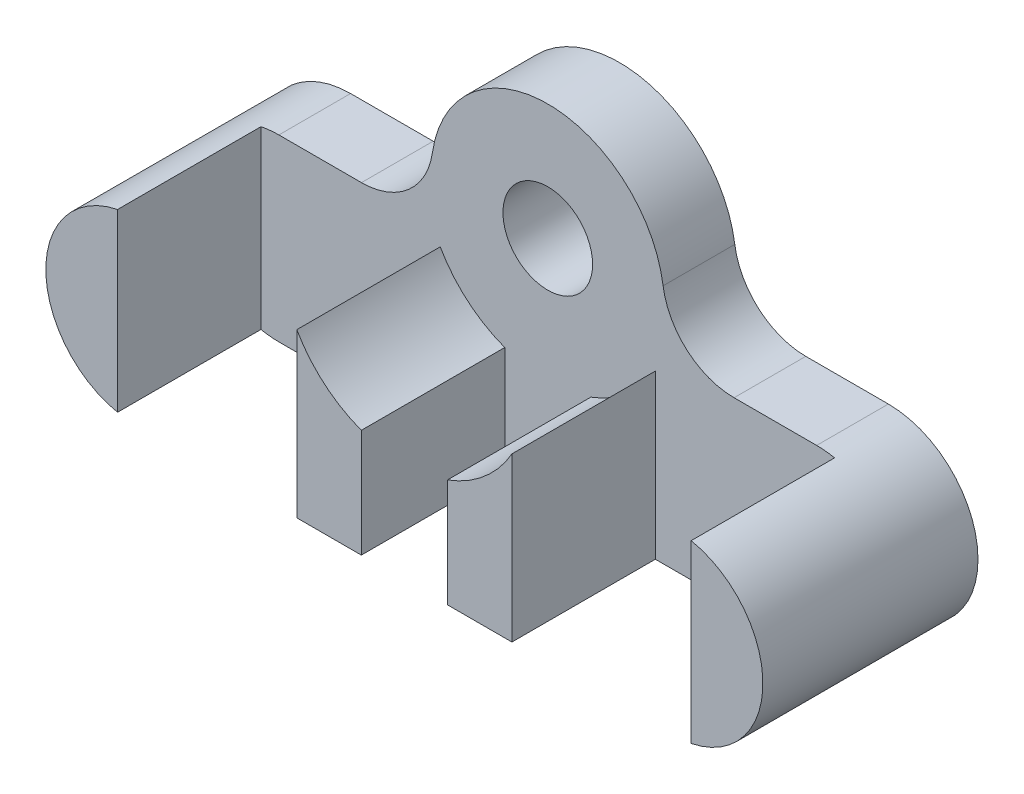
ISO-10303-21;
HEADER;
FILE_DESCRIPTION(('STEP AP214'),'2;1');
FILE_NAME('part.step','',(''),(''),'','','');
FILE_SCHEMA(('AUTOMOTIVE_DESIGN { 1 0 10303 214 1 1 1 1 }'));
ENDSEC;
DATA;
#1=APPLICATION_CONTEXT('core data for automotive mechanical design processes');
#2=APPLICATION_PROTOCOL_DEFINITION('international standard','automotive_design',2000,#1);
#3=PRODUCT_CONTEXT('',#1,'mechanical');
#4=PRODUCT('Part','Part','',(#3));
#5=PRODUCT_RELATED_PRODUCT_CATEGORY('part','',(#4));
#6=PRODUCT_DEFINITION_FORMATION('','',#4);
#7=PRODUCT_DEFINITION_CONTEXT('part definition',#1,'design');
#8=PRODUCT_DEFINITION('design','',#6,#7);
#9=PRODUCT_DEFINITION_SHAPE('','',#8);
#10=(LENGTH_UNIT() NAMED_UNIT(*) SI_UNIT(.MILLI.,.METRE.));
#11=(NAMED_UNIT(*) PLANE_ANGLE_UNIT() SI_UNIT($,.RADIAN.));
#12=(NAMED_UNIT(*) SI_UNIT($,.STERADIAN.) SOLID_ANGLE_UNIT());
#13=UNCERTAINTY_MEASURE_WITH_UNIT(LENGTH_MEASURE(1.E-05),#10,'distance_accuracy_value','');
#14=(GEOMETRIC_REPRESENTATION_CONTEXT(3) GLOBAL_UNCERTAINTY_ASSIGNED_CONTEXT((#13)) GLOBAL_UNIT_ASSIGNED_CONTEXT((#10,
#11,#12)) REPRESENTATION_CONTEXT('',''));
#15=CARTESIAN_POINT('',(0.,0.,0.));
#16=DIRECTION('',(0.,0.,1.));
#17=DIRECTION('',(1.,0.,0.));
#18=AXIS2_PLACEMENT_3D('',#15,#16,#17);
#19=CARTESIAN_POINT('',(0.,0.,6.));
#20=DIRECTION('',(0.,0.,-1.));
#21=DIRECTION('',(-1.,0.,0.));
#22=AXIS2_PLACEMENT_3D('',#19,#20,#21);
#23=CYLINDRICAL_SURFACE('',#22,3.45);
#24=DIRECTION('',(0.,0.,1.));
#25=VECTOR('',#24,1.);
#26=CARTESIAN_POINT('',(-1.2,-3.23457879792717,-1.8539285185263));
#27=LINE('',#26,#25);
#28=CARTESIAN_POINT('',(-1.2,-3.23457879792717,2.));
#29=VERTEX_POINT('',#28);
#30=CARTESIAN_POINT('',(-1.2,-3.23457879792717,6.));
#31=VERTEX_POINT('',#30);
#32=EDGE_CURVE('E187',#29,#31,#27,.T.);
#33=ORIENTED_EDGE('',*,*,#32,.F.);
#34=CARTESIAN_POINT('',(0.,0.,2.));
#35=DIRECTION('',(0.,0.,1.));
#36=DIRECTION('',(1.,0.,0.));
#37=AXIS2_PLACEMENT_3D('',#34,#35,#36);
#38=CIRCLE('',#37,3.45);
#39=CARTESIAN_POINT('',(-3.,-1.70367250374008,2.));
#40=VERTEX_POINT('',#39);
#41=EDGE_CURVE('E220',#40,#29,#38,.T.);
#42=ORIENTED_EDGE('',*,*,#41,.F.);
#43=DIRECTION('',(0.,0.,-1.));
#44=VECTOR('',#43,1.);
#45=CARTESIAN_POINT('',(-3.,-1.70367250374008,6.));
#46=LINE('',#45,#44);
#47=CARTESIAN_POINT('',(-3.,-1.70367250374008,6.));
#48=VERTEX_POINT('',#47);
#49=EDGE_CURVE('E244',#48,#40,#46,.T.);
#50=ORIENTED_EDGE('',*,*,#49,.F.);
#51=CARTESIAN_POINT('',(0.,0.,6.));
#52=DIRECTION('',(0.,0.,1.));
#53=DIRECTION('',(1.,0.,0.));
#54=AXIS2_PLACEMENT_3D('',#51,#52,#53);
#55=CIRCLE('',#54,3.45);
#56=EDGE_CURVE('E427',#48,#31,#55,.T.);
#57=ORIENTED_EDGE('',*,*,#56,.T.);
#58=EDGE_LOOP('',(#33,#42,#50,#57));
#59=FACE_BOUND('',#58,.T.);
#60=ADVANCED_FACE('F44',(#59),#23,.F.);
#61=CARTESIAN_POINT('',(0.,0.,6.));
#62=DIRECTION('',(0.,0.,1.));
#63=DIRECTION('',(1.,0.,0.));
#64=AXIS2_PLACEMENT_3D('',#61,#62,#63);
#65=PLANE('',#64);
#66=DIRECTION('',(0.,-1.,0.));
#67=VECTOR('',#66,1.);
#68=CARTESIAN_POINT('',(-1.2,-6.25,6.));
#69=LINE('',#68,#67);
#70=CARTESIAN_POINT('',(-1.2,-6.25,6.));
#71=VERTEX_POINT('',#70);
#72=EDGE_CURVE('E181',#31,#71,#69,.T.);
#73=ORIENTED_EDGE('',*,*,#72,.F.);
#74=ORIENTED_EDGE('',*,*,#56,.F.);
#75=DIRECTION('',(0.,-1.,0.));
#76=VECTOR('',#75,1.);
#77=CARTESIAN_POINT('',(-3.,0.,6.));
#78=LINE('',#77,#76);
#79=CARTESIAN_POINT('',(-3.,-6.25,6.));
#80=VERTEX_POINT('',#79);
#81=EDGE_CURVE('E206',#48,#80,#78,.T.);
#82=ORIENTED_EDGE('',*,*,#81,.T.);
#83=DIRECTION('',(1.,0.,0.));
#84=VECTOR('',#83,1.);
#85=CARTESIAN_POINT('',(0.,-6.25,6.));
#86=LINE('',#85,#84);
#87=EDGE_CURVE('E199',#80,#71,#86,.T.);
#88=ORIENTED_EDGE('',*,*,#87,.T.);
#89=EDGE_LOOP('',(#73,#74,#82,#88));
#90=FACE_BOUND('',#89,.T.);
#91=ADVANCED_FACE('F204',(#90),#65,.T.);
#92=CARTESIAN_POINT('',(0.,0.,2.));
#93=DIRECTION('',(0.,0.,1.));
#94=DIRECTION('',(1.,0.,0.));
#95=AXIS2_PLACEMENT_3D('',#92,#93,#94);
#96=PLANE('',#95);
#97=ORIENTED_EDGE('',*,*,#41,.T.);
#98=DIRECTION('',(0.,1.,0.));
#99=VECTOR('',#98,1.);
#100=CARTESIAN_POINT('',(-1.2,-6.25,2.));
#101=LINE('',#100,#99);
#102=CARTESIAN_POINT('',(-1.2,-6.25,2.));
#103=VERTEX_POINT('',#102);
#104=EDGE_CURVE('E420',#103,#29,#101,.T.);
#105=ORIENTED_EDGE('',*,*,#104,.F.);
#106=DIRECTION('',(-1.,0.,0.));
#107=VECTOR('',#106,1.);
#108=CARTESIAN_POINT('',(-1.2,-6.25,2.));
#109=LINE('',#108,#107);
#110=CARTESIAN_POINT('',(1.2,-6.25,2.));
#111=VERTEX_POINT('',#110);
#112=EDGE_CURVE('E201',#111,#103,#109,.T.);
#113=ORIENTED_EDGE('',*,*,#112,.F.);
#114=DIRECTION('',(0.,-1.,0.));
#115=VECTOR('',#114,1.);
#116=CARTESIAN_POINT('',(1.2,-6.25,2.));
#117=LINE('',#116,#115);
#118=CARTESIAN_POINT('',(1.2,-3.23457879792717,2.));
#119=VERTEX_POINT('',#118);
#120=EDGE_CURVE('E448',#119,#111,#117,.T.);
#121=ORIENTED_EDGE('',*,*,#120,.F.);
#122=CARTESIAN_POINT('',(3.,-1.70367250374009,2.));
#123=VERTEX_POINT('',#122);
#124=EDGE_CURVE('E225',#119,#123,#38,.T.);
#125=ORIENTED_EDGE('',*,*,#124,.T.);
#126=DIRECTION('',(0.,-1.,0.));
#127=VECTOR('',#126,1.);
#128=CARTESIAN_POINT('',(3.,0.,2.));
#129=LINE('',#128,#127);
#130=CARTESIAN_POINT('',(3.,-6.25,2.));
#131=VERTEX_POINT('',#130);
#132=EDGE_CURVE('E229',#123,#131,#129,.T.);
#133=ORIENTED_EDGE('',*,*,#132,.T.);
#134=DIRECTION('',(1.,0.,0.));
#135=VECTOR('',#134,1.);
#136=CARTESIAN_POINT('',(-7.5,-6.25,2.));
#137=LINE('',#136,#135);
#138=CARTESIAN_POINT('',(7.5,-6.25,2.));
#139=VERTEX_POINT('',#138);
#140=EDGE_CURVE('E286',#131,#139,#137,.T.);
#141=ORIENTED_EDGE('',*,*,#140,.T.);
#142=CARTESIAN_POINT('',(7.5,-3.75,2.));
#143=DIRECTION('',(0.,0.,1.));
#144=DIRECTION('',(1.,0.,0.));
#145=AXIS2_PLACEMENT_3D('',#142,#143,#144);
#146=CIRCLE('',#145,2.5);
#147=CARTESIAN_POINT('',(8.,-6.19948974278318,2.));
#148=VERTEX_POINT('',#147);
#149=EDGE_CURVE('E291',#139,#148,#146,.T.);
#150=ORIENTED_EDGE('',*,*,#149,.T.);
#151=DIRECTION('',(0.,-1.,0.));
#152=VECTOR('',#151,1.);
#153=CARTESIAN_POINT('',(8.,0.,2.));
#154=LINE('',#153,#152);
#155=CARTESIAN_POINT('',(8.,-1.30051025721682,2.));
#156=VERTEX_POINT('',#155);
#157=EDGE_CURVE('E390',#156,#148,#154,.T.);
#158=ORIENTED_EDGE('',*,*,#157,.F.);
#159=CARTESIAN_POINT('',(7.5,-1.25,2.));
#160=VERTEX_POINT('',#159);
#161=EDGE_CURVE('E290',#156,#160,#146,.T.);
#162=ORIENTED_EDGE('',*,*,#161,.T.);
#163=DIRECTION('',(-1.,0.,0.));
#164=VECTOR('',#163,1.);
#165=CARTESIAN_POINT('',(3.,-1.25,2.));
#166=LINE('',#165,#164);
#167=CARTESIAN_POINT('',(5.19615242270663,-1.25,2.));
#168=VERTEX_POINT('',#167);
#169=EDGE_CURVE('E294',#160,#168,#166,.T.);
#170=ORIENTED_EDGE('',*,*,#169,.T.);
#171=CARTESIAN_POINT('',(5.19615242270663,0.75,2.));
#172=DIRECTION('',(0.,0.,1.));
#173=DIRECTION('',(1.,0.,0.));
#174=AXIS2_PLACEMENT_3D('',#171,#172,#173);
#175=CIRCLE('',#174,2.);
#176=CARTESIAN_POINT('',(3.21666578548506,0.464285714285714,2.));
#177=VERTEX_POINT('',#176);
#178=EDGE_CURVE('E349',#168,#177,#175,.F.);
#179=ORIENTED_EDGE('',*,*,#178,.T.);
#180=CARTESIAN_POINT('',(0.,0.,2.));
#181=DIRECTION('',(0.,0.,1.));
#182=DIRECTION('',(1.,0.,0.));
#183=AXIS2_PLACEMENT_3D('',#180,#181,#182);
#184=CIRCLE('',#183,3.25);
#185=CARTESIAN_POINT('',(-3.21666578548506,0.464285714285714,2.));
#186=VERTEX_POINT('',#185);
#187=EDGE_CURVE('E274',#177,#186,#184,.T.);
#188=ORIENTED_EDGE('',*,*,#187,.T.);
#189=CARTESIAN_POINT('',(-5.19615242270663,0.75,2.));
#190=DIRECTION('',(0.,0.,1.));
#191=DIRECTION('',(1.,0.,0.));
#192=AXIS2_PLACEMENT_3D('',#189,#190,#191);
#193=CIRCLE('',#192,2.);
#194=CARTESIAN_POINT('',(-5.19615242270663,-1.25,2.));
#195=VERTEX_POINT('',#194);
#196=EDGE_CURVE('E11',#186,#195,#193,.F.);
#197=ORIENTED_EDGE('',*,*,#196,.T.);
#198=DIRECTION('',(-1.,0.,0.));
#199=VECTOR('',#198,1.);
#200=CARTESIAN_POINT('',(-7.5,-1.25,2.));
#201=LINE('',#200,#199);
#202=CARTESIAN_POINT('',(-7.5,-1.25,2.));
#203=VERTEX_POINT('',#202);
#204=EDGE_CURVE('E277',#195,#203,#201,.T.);
#205=ORIENTED_EDGE('',*,*,#204,.T.);
#206=CARTESIAN_POINT('',(-7.5,-3.75,2.));
#207=DIRECTION('',(0.,0.,1.));
#208=DIRECTION('',(1.,0.,0.));
#209=AXIS2_PLACEMENT_3D('',#206,#207,#208);
#210=CIRCLE('',#209,2.5);
#211=CARTESIAN_POINT('',(-8.,-1.30051025721682,2.));
#212=VERTEX_POINT('',#211);
#213=EDGE_CURVE('E282',#203,#212,#210,.T.);
#214=ORIENTED_EDGE('',*,*,#213,.T.);
#215=DIRECTION('',(0.,-1.,0.));
#216=VECTOR('',#215,1.);
#217=CARTESIAN_POINT('',(-8.,0.,2.));
#218=LINE('',#217,#216);
#219=CARTESIAN_POINT('',(-8.,-6.19948974278318,2.));
#220=VERTEX_POINT('',#219);
#221=EDGE_CURVE('E248',#212,#220,#218,.T.);
#222=ORIENTED_EDGE('',*,*,#221,.T.);
#223=CARTESIAN_POINT('',(-7.5,-6.25,2.));
#224=VERTEX_POINT('',#223);
#225=EDGE_CURVE('E281',#220,#224,#210,.T.);
#226=ORIENTED_EDGE('',*,*,#225,.T.);
#227=CARTESIAN_POINT('',(-3.,-6.25,2.));
#228=VERTEX_POINT('',#227);
#229=EDGE_CURVE('E287',#224,#228,#137,.T.);
#230=ORIENTED_EDGE('',*,*,#229,.T.);
#231=DIRECTION('',(0.,-1.,0.));
#232=VECTOR('',#231,1.);
#233=CARTESIAN_POINT('',(-3.,0.,2.));
#234=LINE('',#233,#232);
#235=EDGE_CURVE('E224',#40,#228,#234,.T.);
#236=ORIENTED_EDGE('',*,*,#235,.F.);
#237=EDGE_LOOP('',(#97,#105,#113,#121,#125,#133,#141,#150,#158,#162,#170,#179,#188,#197,#205,
#214,#222,#226,#230,#236));
#238=FACE_BOUND('',#237,.T.);
#239=CARTESIAN_POINT('',(0.,0.,2.));
#240=DIRECTION('',(0.,0.,1.));
#241=DIRECTION('',(1.,0.,0.));
#242=AXIS2_PLACEMENT_3D('',#239,#240,#241);
#243=CIRCLE('',#242,1.25);
#244=CARTESIAN_POINT('',(1.25,0.,2.));
#245=VERTEX_POINT('',#244);
#246=EDGE_CURVE('E266',#245,#245,#243,.T.);
#247=ORIENTED_EDGE('',*,*,#246,.F.);
#248=EDGE_LOOP('',(#247));
#249=FACE_BOUND('',#248,.T.);
#250=ADVANCED_FACE('F369',(#238,#249),#96,.T.);
#251=CARTESIAN_POINT('',(0.,0.,0.));
#252=DIRECTION('',(0.,0.,1.));
#253=DIRECTION('',(1.,0.,0.));
#254=AXIS2_PLACEMENT_3D('',#251,#252,#253);
#255=PLANE('',#254);
#256=CARTESIAN_POINT('',(0.,0.,0.));
#257=DIRECTION('',(0.,0.,1.));
#258=DIRECTION('',(1.,0.,0.));
#259=AXIS2_PLACEMENT_3D('',#256,#257,#258);
#260=CIRCLE('',#259,3.25);
#261=CARTESIAN_POINT('',(3.21666578548506,0.464285714285714,0.));
#262=VERTEX_POINT('',#261);
#263=CARTESIAN_POINT('',(-3.21666578548506,0.464285714285714,0.));
#264=VERTEX_POINT('',#263);
#265=EDGE_CURVE('E270',#262,#264,#260,.T.);
#266=ORIENTED_EDGE('',*,*,#265,.F.);
#267=CARTESIAN_POINT('',(5.19615242270663,0.75,0.));
#268=DIRECTION('',(0.,0.,1.));
#269=DIRECTION('',(1.,0.,0.));
#270=AXIS2_PLACEMENT_3D('',#267,#268,#269);
#271=CIRCLE('',#270,2.);
#272=CARTESIAN_POINT('',(5.19615242270663,-1.25,0.));
#273=VERTEX_POINT('',#272);
#274=EDGE_CURVE('E346',#262,#273,#271,.T.);
#275=ORIENTED_EDGE('',*,*,#274,.T.);
#276=DIRECTION('',(-1.,0.,0.));
#277=VECTOR('',#276,1.);
#278=CARTESIAN_POINT('',(3.,-1.25,0.));
#279=LINE('',#278,#277);
#280=CARTESIAN_POINT('',(7.5,-1.25,0.));
#281=VERTEX_POINT('',#280);
#282=EDGE_CURVE('E278',#281,#273,#279,.T.);
#283=ORIENTED_EDGE('',*,*,#282,.F.);
#284=CARTESIAN_POINT('',(7.5,-3.75,0.));
#285=DIRECTION('',(0.,0.,1.));
#286=DIRECTION('',(1.,0.,0.));
#287=AXIS2_PLACEMENT_3D('',#284,#285,#286);
#288=CIRCLE('',#287,2.5);
#289=CARTESIAN_POINT('',(7.5,-6.25,0.));
#290=VERTEX_POINT('',#289);
#291=EDGE_CURVE('E311',#290,#281,#288,.T.);
#292=ORIENTED_EDGE('',*,*,#291,.F.);
#293=DIRECTION('',(1.,0.,0.));
#294=VECTOR('',#293,1.);
#295=CARTESIAN_POINT('',(-7.5,-6.25,0.));
#296=LINE('',#295,#294);
#297=CARTESIAN_POINT('',(-7.5,-6.25,0.));
#298=VERTEX_POINT('',#297);
#299=EDGE_CURVE('E308',#298,#290,#296,.T.);
#300=ORIENTED_EDGE('',*,*,#299,.F.);
#301=CARTESIAN_POINT('',(-7.5,-3.75,0.));
#302=DIRECTION('',(0.,0.,1.));
#303=DIRECTION('',(1.,0.,0.));
#304=AXIS2_PLACEMENT_3D('',#301,#302,#303);
#305=CIRCLE('',#304,2.5);
#306=CARTESIAN_POINT('',(-7.5,-1.25,0.));
#307=VERTEX_POINT('',#306);
#308=EDGE_CURVE('E305',#307,#298,#305,.T.);
#309=ORIENTED_EDGE('',*,*,#308,.F.);
#310=DIRECTION('',(-1.,0.,0.));
#311=VECTOR('',#310,1.);
#312=CARTESIAN_POINT('',(-7.5,-1.25,0.));
#313=LINE('',#312,#311);
#314=CARTESIAN_POINT('',(-5.19615242270663,-1.25,0.));
#315=VERTEX_POINT('',#314);
#316=EDGE_CURVE('E302',#315,#307,#313,.T.);
#317=ORIENTED_EDGE('',*,*,#316,.F.);
#318=CARTESIAN_POINT('',(-5.19615242270663,0.75,0.));
#319=DIRECTION('',(0.,0.,1.));
#320=DIRECTION('',(1.,0.,0.));
#321=AXIS2_PLACEMENT_3D('',#318,#319,#320);
#322=CIRCLE('',#321,2.);
#323=EDGE_CURVE('E53',#315,#264,#322,.T.);
#324=ORIENTED_EDGE('',*,*,#323,.T.);
#325=EDGE_LOOP('',(#266,#275,#283,#292,#300,#309,#317,#324));
#326=FACE_BOUND('',#325,.T.);
#327=CARTESIAN_POINT('',(0.,0.,0.));
#328=DIRECTION('',(0.,0.,1.));
#329=DIRECTION('',(1.,0.,0.));
#330=AXIS2_PLACEMENT_3D('',#327,#328,#329);
#331=CIRCLE('',#330,1.25);
#332=CARTESIAN_POINT('',(1.25,0.,0.));
#333=VERTEX_POINT('',#332);
#334=EDGE_CURVE('E265',#333,#333,#331,.T.);
#335=ORIENTED_EDGE('',*,*,#334,.T.);
#336=EDGE_LOOP('',(#335));
#337=FACE_BOUND('',#336,.T.);
#338=ADVANCED_FACE('F355',(#326,#337),#255,.F.);
#339=CARTESIAN_POINT('',(0.,0.,2.));
#340=DIRECTION('',(0.,0.,-1.));
#341=DIRECTION('',(-1.,0.,0.));
#342=AXIS2_PLACEMENT_3D('',#339,#340,#341);
#343=CYLINDRICAL_SURFACE('',#342,3.25);
#344=ORIENTED_EDGE('',*,*,#187,.F.);
#345=DIRECTION('',(0.,0.,-1.));
#346=VECTOR('',#345,1.);
#347=CARTESIAN_POINT('',(3.21666578548506,0.464285714285714,2.));
#348=LINE('',#347,#346);
#349=EDGE_CURVE('E335',#177,#262,#348,.T.);
#350=ORIENTED_EDGE('',*,*,#349,.T.);
#351=ORIENTED_EDGE('',*,*,#265,.T.);
#352=DIRECTION('',(0.,0.,-1.));
#353=VECTOR('',#352,1.);
#354=CARTESIAN_POINT('',(-3.21666578548506,0.464285714285714,2.));
#355=LINE('',#354,#353);
#356=EDGE_CURVE('E332',#264,#186,#355,.F.);
#357=ORIENTED_EDGE('',*,*,#356,.T.);
#358=EDGE_LOOP('',(#344,#350,#351,#357));
#359=FACE_BOUND('',#358,.T.);
#360=ADVANCED_FACE('F363',(#359),#343,.T.);
#361=CARTESIAN_POINT('',(-7.5,-1.25,2.));
#362=DIRECTION('',(0.,-1.,0.));
#363=DIRECTION('',(0.,0.,-1.));
#364=AXIS2_PLACEMENT_3D('',#361,#362,#363);
#365=PLANE('',#364);
#366=ORIENTED_EDGE('',*,*,#204,.F.);
#367=DIRECTION('',(0.,0.,1.));
#368=VECTOR('',#367,1.);
#369=CARTESIAN_POINT('',(-5.19615242270663,-1.25,0.));
#370=LINE('',#369,#368);
#371=EDGE_CURVE('E342',#195,#315,#370,.F.);
#372=ORIENTED_EDGE('',*,*,#371,.T.);
#373=ORIENTED_EDGE('',*,*,#316,.T.);
#374=DIRECTION('',(0.,0.,-1.));
#375=VECTOR('',#374,1.);
#376=CARTESIAN_POINT('',(-7.5,-1.25,2.));
#377=LINE('',#376,#375);
#378=EDGE_CURVE('E328',#203,#307,#377,.T.);
#379=ORIENTED_EDGE('',*,*,#378,.F.);
#380=EDGE_LOOP('',(#366,#372,#373,#379));
#381=FACE_BOUND('',#380,.T.);
#382=ADVANCED_FACE('F366',(#381),#365,.F.);
#383=CARTESIAN_POINT('',(-7.5,-3.75,2.));
#384=DIRECTION('',(0.,0.,-1.));
#385=DIRECTION('',(-1.,0.,0.));
#386=AXIS2_PLACEMENT_3D('',#383,#384,#385);
#387=CYLINDRICAL_SURFACE('',#386,2.5);
#388=ORIENTED_EDGE('',*,*,#308,.T.);
#389=DIRECTION('',(0.,0.,-1.));
#390=VECTOR('',#389,1.);
#391=CARTESIAN_POINT('',(-7.5,-6.25,2.));
#392=LINE('',#391,#390);
#393=EDGE_CURVE('E324',#224,#298,#392,.T.);
#394=ORIENTED_EDGE('',*,*,#393,.F.);
#395=ORIENTED_EDGE('',*,*,#225,.F.);
#396=DIRECTION('',(0.,0.,-1.));
#397=VECTOR('',#396,1.);
#398=CARTESIAN_POINT('',(-8.,-6.19948974278318,6.));
#399=LINE('',#398,#397);
#400=CARTESIAN_POINT('',(-8.,-6.19948974278318,6.));
#401=VERTEX_POINT('',#400);
#402=EDGE_CURVE('E256',#401,#220,#399,.T.);
#403=ORIENTED_EDGE('',*,*,#402,.F.);
#404=CARTESIAN_POINT('',(-7.5,-3.75,6.));
#405=DIRECTION('',(0.,0.,1.));
#406=DIRECTION('',(1.,0.,0.));
#407=AXIS2_PLACEMENT_3D('',#404,#405,#406);
#408=CIRCLE('',#407,2.5);
#409=CARTESIAN_POINT('',(-8.,-1.30051025721682,6.));
#410=VERTEX_POINT('',#409);
#411=EDGE_CURVE('E253',#410,#401,#408,.T.);
#412=ORIENTED_EDGE('',*,*,#411,.F.);
#413=DIRECTION('',(0.,0.,-1.));
#414=VECTOR('',#413,1.);
#415=CARTESIAN_POINT('',(-8.,-1.30051025721682,6.));
#416=LINE('',#415,#414);
#417=EDGE_CURVE('E262',#410,#212,#416,.T.);
#418=ORIENTED_EDGE('',*,*,#417,.T.);
#419=ORIENTED_EDGE('',*,*,#213,.F.);
#420=ORIENTED_EDGE('',*,*,#378,.T.);
#421=EDGE_LOOP('',(#388,#394,#395,#403,#412,#418,#419,#420));
#422=FACE_BOUND('',#421,.T.);
#423=ADVANCED_FACE('F374',(#422),#387,.T.);
#424=CARTESIAN_POINT('',(-7.5,-6.25,2.));
#425=DIRECTION('',(0.,1.,0.));
#426=DIRECTION('',(0.,0.,1.));
#427=AXIS2_PLACEMENT_3D('',#424,#425,#426);
#428=PLANE('',#427);
#429=ORIENTED_EDGE('',*,*,#112,.T.);
#430=DIRECTION('',(0.,0.,1.));
#431=VECTOR('',#430,1.);
#432=CARTESIAN_POINT('',(-1.2,-6.25,-1.8539285185263));
#433=LINE('',#432,#431);
#434=EDGE_CURVE('E184',#103,#71,#433,.T.);
#435=ORIENTED_EDGE('',*,*,#434,.T.);
#436=ORIENTED_EDGE('',*,*,#87,.F.);
#437=DIRECTION('',(0.,0.,-1.));
#438=VECTOR('',#437,1.);
#439=CARTESIAN_POINT('',(-3.,-6.25,6.));
#440=LINE('',#439,#438);
#441=EDGE_CURVE('E241',#80,#228,#440,.T.);
#442=ORIENTED_EDGE('',*,*,#441,.T.);
#443=ORIENTED_EDGE('',*,*,#229,.F.);
#444=ORIENTED_EDGE('',*,*,#393,.T.);
#445=ORIENTED_EDGE('',*,*,#299,.T.);
#446=DIRECTION('',(0.,0.,-1.));
#447=VECTOR('',#446,1.);
#448=CARTESIAN_POINT('',(7.5,-6.25,2.));
#449=LINE('',#448,#447);
#450=EDGE_CURVE('E320',#139,#290,#449,.T.);
#451=ORIENTED_EDGE('',*,*,#450,.F.);
#452=ORIENTED_EDGE('',*,*,#140,.F.);
#453=DIRECTION('',(0.,0.,-1.));
#454=VECTOR('',#453,1.);
#455=CARTESIAN_POINT('',(3.,-6.25,6.));
#456=LINE('',#455,#454);
#457=CARTESIAN_POINT('',(3.,-6.25,6.));
#458=VERTEX_POINT('',#457);
#459=EDGE_CURVE('E237',#458,#131,#456,.T.);
#460=ORIENTED_EDGE('',*,*,#459,.F.);
#461=CARTESIAN_POINT('',(1.2,-6.25,6.));
#462=VERTEX_POINT('',#461);
#463=EDGE_CURVE('E210',#462,#458,#86,.T.);
#464=ORIENTED_EDGE('',*,*,#463,.F.);
#465=DIRECTION('',(0.,0.,1.));
#466=VECTOR('',#465,1.);
#467=CARTESIAN_POINT('',(1.2,-6.25,-1.8539285185263));
#468=LINE('',#467,#466);
#469=EDGE_CURVE('E60',#111,#462,#468,.T.);
#470=ORIENTED_EDGE('',*,*,#469,.F.);
#471=EDGE_LOOP('',(#429,#435,#436,#442,#443,#444,#445,#451,#452,#460,#464,#470));
#472=FACE_BOUND('',#471,.T.);
#473=ADVANCED_FACE('F197',(#472),#428,.F.);
#474=CARTESIAN_POINT('',(7.5,-3.75,2.));
#475=DIRECTION('',(0.,0.,-1.));
#476=DIRECTION('',(-1.,0.,0.));
#477=AXIS2_PLACEMENT_3D('',#474,#475,#476);
#478=CYLINDRICAL_SURFACE('',#477,2.5);
#479=ORIENTED_EDGE('',*,*,#291,.T.);
#480=DIRECTION('',(0.,0.,-1.));
#481=VECTOR('',#480,1.);
#482=CARTESIAN_POINT('',(7.5,-1.25,2.));
#483=LINE('',#482,#481);
#484=EDGE_CURVE('E298',#160,#281,#483,.T.);
#485=ORIENTED_EDGE('',*,*,#484,.F.);
#486=ORIENTED_EDGE('',*,*,#161,.F.);
#487=DIRECTION('',(0.,0.,-1.));
#488=VECTOR('',#487,1.);
#489=CARTESIAN_POINT('',(8.,-1.30051025721682,6.));
#490=LINE('',#489,#488);
#491=CARTESIAN_POINT('',(8.,-1.30051025721682,6.));
#492=VERTEX_POINT('',#491);
#493=EDGE_CURVE('E411',#492,#156,#490,.T.);
#494=ORIENTED_EDGE('',*,*,#493,.F.);
#495=CARTESIAN_POINT('',(7.5,-3.75,6.));
#496=DIRECTION('',(0.,0.,1.));
#497=DIRECTION('',(1.,0.,0.));
#498=AXIS2_PLACEMENT_3D('',#495,#496,#497);
#499=CIRCLE('',#498,2.5);
#500=CARTESIAN_POINT('',(8.,-6.19948974278318,6.));
#501=VERTEX_POINT('',#500);
#502=EDGE_CURVE('E413',#501,#492,#499,.T.);
#503=ORIENTED_EDGE('',*,*,#502,.F.);
#504=DIRECTION('',(0.,0.,-1.));
#505=VECTOR('',#504,1.);
#506=CARTESIAN_POINT('',(8.,-6.19948974278318,6.));
#507=LINE('',#506,#505);
#508=EDGE_CURVE('E408',#501,#148,#507,.T.);
#509=ORIENTED_EDGE('',*,*,#508,.T.);
#510=ORIENTED_EDGE('',*,*,#149,.F.);
#511=ORIENTED_EDGE('',*,*,#450,.T.);
#512=EDGE_LOOP('',(#479,#485,#486,#494,#503,#509,#510,#511));
#513=FACE_BOUND('',#512,.T.);
#514=ADVANCED_FACE('F394',(#513),#478,.T.);
#515=CARTESIAN_POINT('',(3.,-1.25,2.));
#516=DIRECTION('',(0.,-1.,0.));
#517=DIRECTION('',(0.,0.,-1.));
#518=AXIS2_PLACEMENT_3D('',#515,#516,#517);
#519=PLANE('',#518);
#520=ORIENTED_EDGE('',*,*,#282,.T.);
#521=DIRECTION('',(0.,0.,1.));
#522=VECTOR('',#521,1.);
#523=CARTESIAN_POINT('',(5.19615242270663,-1.25,2.));
#524=LINE('',#523,#522);
#525=EDGE_CURVE('E339',#273,#168,#524,.T.);
#526=ORIENTED_EDGE('',*,*,#525,.T.);
#527=ORIENTED_EDGE('',*,*,#169,.F.);
#528=ORIENTED_EDGE('',*,*,#484,.T.);
#529=EDGE_LOOP('',(#520,#526,#527,#528));
#530=FACE_BOUND('',#529,.T.);
#531=ADVANCED_FACE('F398',(#530),#519,.F.);
#532=CARTESIAN_POINT('',(0.,0.,2.));
#533=DIRECTION('',(0.,0.,-1.));
#534=DIRECTION('',(-1.,0.,0.));
#535=AXIS2_PLACEMENT_3D('',#532,#533,#534);
#536=CYLINDRICAL_SURFACE('',#535,1.25);
#537=ORIENTED_EDGE('',*,*,#246,.T.);
#538=EDGE_LOOP('',(#537));
#539=FACE_BOUND('',#538,.T.);
#540=ORIENTED_EDGE('',*,*,#334,.F.);
#541=EDGE_LOOP('',(#540));
#542=FACE_BOUND('',#541,.T.);
#543=ADVANCED_FACE('F484',(#539,#542),#536,.F.);
#544=CARTESIAN_POINT('',(-8.,0.,6.));
#545=DIRECTION('',(1.,0.,0.));
#546=DIRECTION('',(0.,0.,-1.));
#547=AXIS2_PLACEMENT_3D('',#544,#545,#546);
#548=PLANE('',#547);
#549=ORIENTED_EDGE('',*,*,#221,.F.);
#550=ORIENTED_EDGE('',*,*,#417,.F.);
#551=DIRECTION('',(0.,-1.,0.));
#552=VECTOR('',#551,1.);
#553=CARTESIAN_POINT('',(-8.,0.,6.));
#554=LINE('',#553,#552);
#555=EDGE_CURVE('E249',#410,#401,#554,.T.);
#556=ORIENTED_EDGE('',*,*,#555,.T.);
#557=ORIENTED_EDGE('',*,*,#402,.T.);
#558=EDGE_LOOP('',(#549,#550,#556,#557));
#559=FACE_BOUND('',#558,.T.);
#560=ADVANCED_FACE('F379',(#559),#548,.T.);
#561=CARTESIAN_POINT('',(0.,0.,6.));
#562=DIRECTION('',(0.,0.,1.));
#563=DIRECTION('',(1.,0.,0.));
#564=AXIS2_PLACEMENT_3D('',#561,#562,#563);
#565=PLANE('',#564);
#566=ORIENTED_EDGE('',*,*,#555,.F.);
#567=ORIENTED_EDGE('',*,*,#411,.T.);
#568=EDGE_LOOP('',(#566,#567));
#569=FACE_BOUND('',#568,.T.);
#570=ADVANCED_FACE('F472',(#569),#565,.T.);
#571=DIRECTION('',(0.,0.,1.));
#572=VECTOR('',#571,1.);
#573=CARTESIAN_POINT('',(1.2,-3.23457879792717,-1.8539285185263));
#574=LINE('',#573,#572);
#575=CARTESIAN_POINT('',(1.2,-3.23457879792717,6.));
#576=VERTEX_POINT('',#575);
#577=EDGE_CURVE('E440',#119,#576,#574,.T.);
#578=ORIENTED_EDGE('',*,*,#577,.T.);
#579=CARTESIAN_POINT('',(3.,-1.70367250374009,6.));
#580=VERTEX_POINT('',#579);
#581=EDGE_CURVE('E233',#576,#580,#55,.T.);
#582=ORIENTED_EDGE('',*,*,#581,.T.);
#583=DIRECTION('',(0.,0.,-1.));
#584=VECTOR('',#583,1.);
#585=CARTESIAN_POINT('',(3.,-1.70367250374009,6.));
#586=LINE('',#585,#584);
#587=EDGE_CURVE('E215',#580,#123,#586,.T.);
#588=ORIENTED_EDGE('',*,*,#587,.T.);
#589=ORIENTED_EDGE('',*,*,#124,.F.);
#590=EDGE_LOOP('',(#578,#582,#588,#589));
#591=FACE_BOUND('',#590,.T.);
#592=ADVANCED_FACE('F436',(#591),#23,.F.);
#593=CARTESIAN_POINT('',(-3.,0.,6.));
#594=DIRECTION('',(1.,0.,0.));
#595=DIRECTION('',(0.,0.,-1.));
#596=AXIS2_PLACEMENT_3D('',#593,#594,#595);
#597=PLANE('',#596);
#598=ORIENTED_EDGE('',*,*,#235,.T.);
#599=ORIENTED_EDGE('',*,*,#441,.F.);
#600=ORIENTED_EDGE('',*,*,#81,.F.);
#601=ORIENTED_EDGE('',*,*,#49,.T.);
#602=EDGE_LOOP('',(#598,#599,#600,#601));
#603=FACE_BOUND('',#602,.T.);
#604=ADVANCED_FACE('F471',(#603),#597,.F.);
#605=CARTESIAN_POINT('',(3.,0.,6.));
#606=DIRECTION('',(1.,0.,0.));
#607=DIRECTION('',(0.,0.,-1.));
#608=AXIS2_PLACEMENT_3D('',#605,#606,#607);
#609=PLANE('',#608);
#610=ORIENTED_EDGE('',*,*,#132,.F.);
#611=ORIENTED_EDGE('',*,*,#587,.F.);
#612=DIRECTION('',(0.,-1.,0.));
#613=VECTOR('',#612,1.);
#614=CARTESIAN_POINT('',(3.,0.,6.));
#615=LINE('',#614,#613);
#616=EDGE_CURVE('E209',#580,#458,#615,.T.);
#617=ORIENTED_EDGE('',*,*,#616,.T.);
#618=ORIENTED_EDGE('',*,*,#459,.T.);
#619=EDGE_LOOP('',(#610,#611,#617,#618));
#620=FACE_BOUND('',#619,.T.);
#621=ADVANCED_FACE('F444',(#620),#609,.T.);
#622=DIRECTION('',(0.,1.,0.));
#623=VECTOR('',#622,1.);
#624=CARTESIAN_POINT('',(1.2,-6.25,6.));
#625=LINE('',#624,#623);
#626=EDGE_CURVE('E193',#462,#576,#625,.T.);
#627=ORIENTED_EDGE('',*,*,#626,.F.);
#628=ORIENTED_EDGE('',*,*,#463,.T.);
#629=ORIENTED_EDGE('',*,*,#616,.F.);
#630=ORIENTED_EDGE('',*,*,#581,.F.);
#631=EDGE_LOOP('',(#627,#628,#629,#630));
#632=FACE_BOUND('',#631,.T.);
#633=ADVANCED_FACE('F445',(#632),#65,.T.);
#634=CARTESIAN_POINT('',(8.,0.,6.));
#635=DIRECTION('',(1.,0.,0.));
#636=DIRECTION('',(0.,0.,-1.));
#637=AXIS2_PLACEMENT_3D('',#634,#635,#636);
#638=PLANE('',#637);
#639=ORIENTED_EDGE('',*,*,#157,.T.);
#640=ORIENTED_EDGE('',*,*,#508,.F.);
#641=DIRECTION('',(0.,-1.,0.));
#642=VECTOR('',#641,1.);
#643=CARTESIAN_POINT('',(8.,0.,6.));
#644=LINE('',#643,#642);
#645=EDGE_CURVE('E418',#492,#501,#644,.T.);
#646=ORIENTED_EDGE('',*,*,#645,.F.);
#647=ORIENTED_EDGE('',*,*,#493,.T.);
#648=EDGE_LOOP('',(#639,#640,#646,#647));
#649=FACE_BOUND('',#648,.T.);
#650=ADVANCED_FACE('F410',(#649),#638,.F.);
#651=CARTESIAN_POINT('',(0.,0.,6.));
#652=DIRECTION('',(0.,0.,1.));
#653=DIRECTION('',(1.,0.,0.));
#654=AXIS2_PLACEMENT_3D('',#651,#652,#653);
#655=PLANE('',#654);
#656=ORIENTED_EDGE('',*,*,#502,.T.);
#657=ORIENTED_EDGE('',*,*,#645,.T.);
#658=EDGE_LOOP('',(#656,#657));
#659=FACE_BOUND('',#658,.T.);
#660=ADVANCED_FACE('F452',(#659),#655,.T.);
#661=CARTESIAN_POINT('',(5.19615242270663,0.75,2.));
#662=DIRECTION('',(0.,0.,-1.));
#663=DIRECTION('',(-1.,0.,0.));
#664=AXIS2_PLACEMENT_3D('',#661,#662,#663);
#665=CYLINDRICAL_SURFACE('',#664,2.);
#666=ORIENTED_EDGE('',*,*,#178,.F.);
#667=ORIENTED_EDGE('',*,*,#525,.F.);
#668=ORIENTED_EDGE('',*,*,#274,.F.);
#669=ORIENTED_EDGE('',*,*,#349,.F.);
#670=EDGE_LOOP('',(#666,#667,#668,#669));
#671=FACE_BOUND('',#670,.T.);
#672=ADVANCED_FACE('F401',(#671),#665,.F.);
#673=CARTESIAN_POINT('',(-5.19615242270663,0.75,2.));
#674=DIRECTION('',(0.,0.,-1.));
#675=DIRECTION('',(-1.,0.,0.));
#676=AXIS2_PLACEMENT_3D('',#673,#674,#675);
#677=CYLINDRICAL_SURFACE('',#676,2.);
#678=ORIENTED_EDGE('',*,*,#196,.F.);
#679=ORIENTED_EDGE('',*,*,#356,.F.);
#680=ORIENTED_EDGE('',*,*,#323,.F.);
#681=ORIENTED_EDGE('',*,*,#371,.F.);
#682=EDGE_LOOP('',(#678,#679,#680,#681));
#683=FACE_BOUND('',#682,.T.);
#684=ADVANCED_FACE('F46',(#683),#677,.F.);
#685=CARTESIAN_POINT('',(-1.2,-6.25,-1.8539285185263));
#686=DIRECTION('',(-1.,0.,0.));
#687=DIRECTION('',(0.,0.,1.));
#688=AXIS2_PLACEMENT_3D('',#685,#686,#687);
#689=PLANE('',#688);
#690=ORIENTED_EDGE('',*,*,#104,.T.);
#691=ORIENTED_EDGE('',*,*,#32,.T.);
#692=ORIENTED_EDGE('',*,*,#72,.T.);
#693=ORIENTED_EDGE('',*,*,#434,.F.);
#694=EDGE_LOOP('',(#690,#691,#692,#693));
#695=FACE_BOUND('',#694,.T.);
#696=ADVANCED_FACE('F183',(#695),#689,.F.);
#697=CARTESIAN_POINT('',(1.2,-6.25,-1.8539285185263));
#698=DIRECTION('',(1.,0.,0.));
#699=DIRECTION('',(0.,1.,0.));
#700=AXIS2_PLACEMENT_3D('',#697,#698,#699);
#701=PLANE('',#700);
#702=ORIENTED_EDGE('',*,*,#120,.T.);
#703=ORIENTED_EDGE('',*,*,#469,.T.);
#704=ORIENTED_EDGE('',*,*,#626,.T.);
#705=ORIENTED_EDGE('',*,*,#577,.F.);
#706=EDGE_LOOP('',(#702,#703,#704,#705));
#707=FACE_BOUND('',#706,.T.);
#708=ADVANCED_FACE('F677',(#707),#701,.F.);
#709=CLOSED_SHELL('',(#60,#91,#250,#338,#360,#382,#423,#473,#514,#531,#543,#560,#570,#592,#604,
#621,#633,#650,#660,#672,#684,#696,#708));
#710=MANIFOLD_SOLID_BREP('B2',#709);
#711=ADVANCED_BREP_SHAPE_REPRESENTATION('',(#18,#710),#14);
#712=SHAPE_DEFINITION_REPRESENTATION(#9,#711);
ENDSEC;
END-ISO-10303-21;
